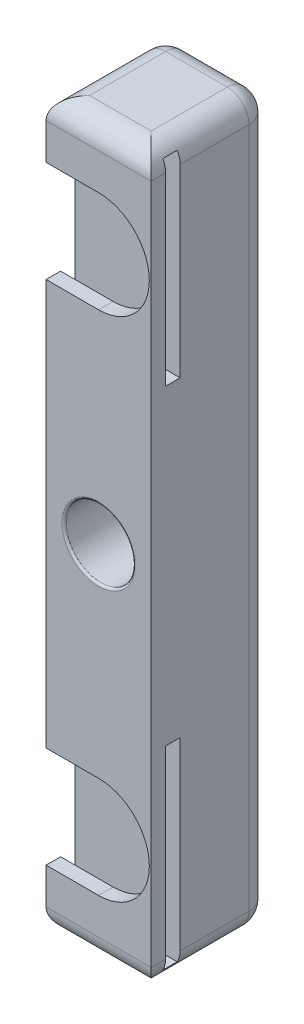
ISO-10303-21;
HEADER;
FILE_DESCRIPTION(('STEP AP214'),'2;1');
FILE_NAME('part.step','',(''),(''),'','','');
FILE_SCHEMA(('AUTOMOTIVE_DESIGN { 1 0 10303 214 1 1 1 1 }'));
ENDSEC;
DATA;
#1=APPLICATION_CONTEXT('core data for automotive mechanical design processes');
#2=APPLICATION_PROTOCOL_DEFINITION('international standard','automotive_design',2000,#1);
#3=PRODUCT_CONTEXT('',#1,'mechanical');
#4=PRODUCT('Part','Part','',(#3));
#5=PRODUCT_RELATED_PRODUCT_CATEGORY('part','',(#4));
#6=PRODUCT_DEFINITION_FORMATION('','',#4);
#7=PRODUCT_DEFINITION_CONTEXT('part definition',#1,'design');
#8=PRODUCT_DEFINITION('design','',#6,#7);
#9=PRODUCT_DEFINITION_SHAPE('','',#8);
#10=(LENGTH_UNIT() NAMED_UNIT(*) SI_UNIT(.MILLI.,.METRE.));
#11=(NAMED_UNIT(*) PLANE_ANGLE_UNIT() SI_UNIT($,.RADIAN.));
#12=(NAMED_UNIT(*) SI_UNIT($,.STERADIAN.) SOLID_ANGLE_UNIT());
#13=UNCERTAINTY_MEASURE_WITH_UNIT(LENGTH_MEASURE(1.E-05),#10,'distance_accuracy_value','');
#14=(GEOMETRIC_REPRESENTATION_CONTEXT(3) GLOBAL_UNCERTAINTY_ASSIGNED_CONTEXT((#13)) GLOBAL_UNIT_ASSIGNED_CONTEXT((#10,
#11,#12)) REPRESENTATION_CONTEXT('',''));
#15=CARTESIAN_POINT('',(0.,0.,0.));
#16=DIRECTION('',(0.,0.,1.));
#17=DIRECTION('',(1.,0.,0.));
#18=AXIS2_PLACEMENT_3D('',#15,#16,#17);
#19=CARTESIAN_POINT('',(-7.25,-50.,16.5));
#20=DIRECTION('',(1.,0.,0.));
#21=DIRECTION('',(0.,0.,-1.));
#22=AXIS2_PLACEMENT_3D('',#19,#20,#21);
#23=PLANE('',#22);
#24=DIRECTION('',(0.,-1.,0.));
#25=VECTOR('',#24,1.);
#26=CARTESIAN_POINT('',(-7.25,-50.,3.));
#27=LINE('',#26,#25);
#28=CARTESIAN_POINT('',(-7.25,47.,3.));
#29=VERTEX_POINT('',#28);
#30=CARTESIAN_POINT('',(-7.25,-47.,3.));
#31=VERTEX_POINT('',#30);
#32=EDGE_CURVE('E358',#29,#31,#27,.T.);
#33=ORIENTED_EDGE('',*,*,#32,.T.);
#34=DIRECTION('',(0.,0.,-1.));
#35=VECTOR('',#34,1.);
#36=CARTESIAN_POINT('',(-7.25,-47.,16.5));
#37=LINE('',#36,#35);
#38=CARTESIAN_POINT('',(-7.25,-47.,12.5));
#39=VERTEX_POINT('',#38);
#40=EDGE_CURVE('E393',#31,#39,#37,.F.);
#41=ORIENTED_EDGE('',*,*,#40,.T.);
#42=DIRECTION('',(0.,1.,0.));
#43=VECTOR('',#42,1.);
#44=CARTESIAN_POINT('',(-7.25,-50.,12.5));
#45=LINE('',#44,#43);
#46=CARTESIAN_POINT('',(-7.25,-21.5,12.5));
#47=VERTEX_POINT('',#46);
#48=EDGE_CURVE('E321',#39,#47,#45,.T.);
#49=ORIENTED_EDGE('',*,*,#48,.T.);
#50=DIRECTION('',(0.,0.,1.));
#51=VECTOR('',#50,1.);
#52=CARTESIAN_POINT('',(-7.25,-21.5,16.5));
#53=LINE('',#52,#51);
#54=CARTESIAN_POINT('',(-7.25,-21.5,14.5));
#55=VERTEX_POINT('',#54);
#56=EDGE_CURVE('E330',#47,#55,#53,.T.);
#57=ORIENTED_EDGE('',*,*,#56,.T.);
#58=DIRECTION('',(0.,1.,0.));
#59=VECTOR('',#58,1.);
#60=CARTESIAN_POINT('',(-7.25,-50.,14.5));
#61=LINE('',#60,#59);
#62=CARTESIAN_POINT('',(-7.25,-28.,14.5));
#63=VERTEX_POINT('',#62);
#64=EDGE_CURVE('E319',#63,#55,#61,.T.);
#65=ORIENTED_EDGE('',*,*,#64,.F.);
#66=DIRECTION('',(0.,0.,1.));
#67=VECTOR('',#66,1.);
#68=CARTESIAN_POINT('',(-7.25,-28.,14.5));
#69=LINE('',#68,#67);
#70=CARTESIAN_POINT('',(-7.25,-28.,16.5));
#71=VERTEX_POINT('',#70);
#72=EDGE_CURVE('E310',#63,#71,#69,.T.);
#73=ORIENTED_EDGE('',*,*,#72,.T.);
#74=DIRECTION('',(0.,-1.,0.));
#75=VECTOR('',#74,1.);
#76=CARTESIAN_POINT('',(-7.25,-50.,16.5));
#77=LINE('',#76,#75);
#78=CARTESIAN_POINT('',(-7.25,28.,16.5));
#79=VERTEX_POINT('',#78);
#80=EDGE_CURVE('E340',#79,#71,#77,.T.);
#81=ORIENTED_EDGE('',*,*,#80,.F.);
#82=DIRECTION('',(0.,0.,1.));
#83=VECTOR('',#82,1.);
#84=CARTESIAN_POINT('',(-7.25,28.,14.5));
#85=LINE('',#84,#83);
#86=CARTESIAN_POINT('',(-7.25,28.,14.5));
#87=VERTEX_POINT('',#86);
#88=EDGE_CURVE('E252',#87,#79,#85,.T.);
#89=ORIENTED_EDGE('',*,*,#88,.F.);
#90=DIRECTION('',(0.,1.,0.));
#91=VECTOR('',#90,1.);
#92=CARTESIAN_POINT('',(-7.25,-50.,14.5));
#93=LINE('',#92,#91);
#94=CARTESIAN_POINT('',(-7.25,21.5,14.5));
#95=VERTEX_POINT('',#94);
#96=EDGE_CURVE('E266',#95,#87,#93,.T.);
#97=ORIENTED_EDGE('',*,*,#96,.F.);
#98=DIRECTION('',(0.,0.,1.));
#99=VECTOR('',#98,1.);
#100=CARTESIAN_POINT('',(-7.25,21.5,16.5));
#101=LINE('',#100,#99);
#102=CARTESIAN_POINT('',(-7.25,21.5,12.5));
#103=VERTEX_POINT('',#102);
#104=EDGE_CURVE('E276',#103,#95,#101,.T.);
#105=ORIENTED_EDGE('',*,*,#104,.F.);
#106=DIRECTION('',(0.,1.,0.));
#107=VECTOR('',#106,1.);
#108=CARTESIAN_POINT('',(-7.25,-50.,12.5));
#109=LINE('',#108,#107);
#110=CARTESIAN_POINT('',(-7.25,47.,12.5));
#111=VERTEX_POINT('',#110);
#112=EDGE_CURVE('E269',#103,#111,#109,.T.);
#113=ORIENTED_EDGE('',*,*,#112,.T.);
#114=DIRECTION('',(0.,0.,-1.));
#115=VECTOR('',#114,1.);
#116=CARTESIAN_POINT('',(-7.25,47.,16.5));
#117=LINE('',#116,#115);
#118=EDGE_CURVE('E388',#111,#29,#117,.T.);
#119=ORIENTED_EDGE('',*,*,#118,.T.);
#120=EDGE_LOOP('',(#33,#41,#49,#57,#65,#73,#81,#89,#97,#105,#113,#119));
#121=FACE_BOUND('',#120,.T.);
#122=ADVANCED_FACE('F41',(#121),#23,.F.);
#123=CARTESIAN_POINT('',(-7.25,47.,16.5));
#124=VERTEX_POINT('',#123);
#125=CARTESIAN_POINT('',(-7.25,42.,16.5));
#126=VERTEX_POINT('',#125);
#127=EDGE_CURVE('E332',#124,#126,#77,.T.);
#128=ORIENTED_EDGE('',*,*,#127,.F.);
#129=DIRECTION('',(0.,0.,-1.));
#130=VECTOR('',#129,1.);
#131=CARTESIAN_POINT('',(-7.25,47.,16.5));
#132=LINE('',#131,#130);
#133=CARTESIAN_POINT('',(-7.25,47.,14.5));
#134=VERTEX_POINT('',#133);
#135=EDGE_CURVE('E264',#124,#134,#132,.T.);
#136=ORIENTED_EDGE('',*,*,#135,.T.);
#137=CARTESIAN_POINT('',(-7.25,42.,14.5));
#138=VERTEX_POINT('',#137);
#139=EDGE_CURVE('E260',#138,#134,#93,.T.);
#140=ORIENTED_EDGE('',*,*,#139,.F.);
#141=DIRECTION('',(0.,0.,1.));
#142=VECTOR('',#141,1.);
#143=CARTESIAN_POINT('',(-7.25,42.,14.5));
#144=LINE('',#143,#142);
#145=EDGE_CURVE('E241',#138,#126,#144,.T.);
#146=ORIENTED_EDGE('',*,*,#145,.T.);
#147=EDGE_LOOP('',(#128,#136,#140,#146));
#148=FACE_BOUND('',#147,.T.);
#149=ADVANCED_FACE('F263',(#148),#23,.F.);
#150=CARTESIAN_POINT('',(4.25,-50.,3.));
#151=DIRECTION('',(0.,-1.,0.));
#152=DIRECTION('',(0.,0.,-1.));
#153=AXIS2_PLACEMENT_3D('',#150,#151,#152);
#154=CYLINDRICAL_SURFACE('',#153,3.);
#155=DIRECTION('',(0.,1.,0.));
#156=VECTOR('',#155,1.);
#157=CARTESIAN_POINT('',(7.25,-50.,3.));
#158=LINE('',#157,#156);
#159=CARTESIAN_POINT('',(7.25,-47.,3.));
#160=VERTEX_POINT('',#159);
#161=CARTESIAN_POINT('',(7.25,47.,3.));
#162=VERTEX_POINT('',#161);
#163=EDGE_CURVE('E365',#160,#162,#158,.T.);
#164=ORIENTED_EDGE('',*,*,#163,.F.);
#165=CARTESIAN_POINT('',(4.25,-47.,3.));
#166=DIRECTION('',(0.,-1.,0.));
#167=DIRECTION('',(0.,0.,-1.));
#168=AXIS2_PLACEMENT_3D('',#165,#166,#167);
#169=CIRCLE('',#168,3.);
#170=CARTESIAN_POINT('',(4.25,-47.,0.));
#171=VERTEX_POINT('',#170);
#172=EDGE_CURVE('E422',#160,#171,#169,.F.);
#173=ORIENTED_EDGE('',*,*,#172,.T.);
#174=DIRECTION('',(0.,1.,0.));
#175=VECTOR('',#174,1.);
#176=CARTESIAN_POINT('',(4.25,-50.,0.));
#177=LINE('',#176,#175);
#178=CARTESIAN_POINT('',(4.25,47.,0.));
#179=VERTEX_POINT('',#178);
#180=EDGE_CURVE('E362',#179,#171,#177,.F.);
#181=ORIENTED_EDGE('',*,*,#180,.F.);
#182=CARTESIAN_POINT('',(4.25,47.,3.));
#183=DIRECTION('',(0.,-1.,0.));
#184=DIRECTION('',(0.,0.,-1.));
#185=AXIS2_PLACEMENT_3D('',#182,#183,#184);
#186=CIRCLE('',#185,3.);
#187=EDGE_CURVE('E419',#179,#162,#186,.T.);
#188=ORIENTED_EDGE('',*,*,#187,.T.);
#189=EDGE_LOOP('',(#164,#173,#181,#188));
#190=FACE_BOUND('',#189,.T.);
#191=ADVANCED_FACE('F581',(#190),#154,.T.);
#192=CARTESIAN_POINT('',(-4.25,-50.,3.));
#193=DIRECTION('',(0.,1.,0.));
#194=DIRECTION('',(0.,0.,1.));
#195=AXIS2_PLACEMENT_3D('',#192,#193,#194);
#196=CYLINDRICAL_SURFACE('',#195,3.);
#197=DIRECTION('',(0.,-1.,0.));
#198=VECTOR('',#197,1.);
#199=CARTESIAN_POINT('',(-4.25,-50.,0.));
#200=LINE('',#199,#198);
#201=CARTESIAN_POINT('',(-4.25,-47.,0.));
#202=VERTEX_POINT('',#201);
#203=CARTESIAN_POINT('',(-4.25,47.,0.));
#204=VERTEX_POINT('',#203);
#205=EDGE_CURVE('E360',#202,#204,#200,.F.);
#206=ORIENTED_EDGE('',*,*,#205,.F.);
#207=CARTESIAN_POINT('',(-4.25,-47.,3.));
#208=DIRECTION('',(0.,1.,0.));
#209=DIRECTION('',(0.,0.,1.));
#210=AXIS2_PLACEMENT_3D('',#207,#208,#209);
#211=CIRCLE('',#210,3.);
#212=EDGE_CURVE('E376',#202,#31,#211,.T.);
#213=ORIENTED_EDGE('',*,*,#212,.T.);
#214=ORIENTED_EDGE('',*,*,#32,.F.);
#215=CARTESIAN_POINT('',(-4.25,47.,3.));
#216=DIRECTION('',(0.,1.,0.));
#217=DIRECTION('',(0.,0.,1.));
#218=AXIS2_PLACEMENT_3D('',#215,#216,#217);
#219=CIRCLE('',#218,3.);
#220=EDGE_CURVE('E372',#29,#204,#219,.F.);
#221=ORIENTED_EDGE('',*,*,#220,.T.);
#222=EDGE_LOOP('',(#206,#213,#214,#221));
#223=FACE_BOUND('',#222,.T.);
#224=ADVANCED_FACE('F601',(#223),#196,.T.);
#225=CARTESIAN_POINT('',(0.,0.,16.5));
#226=DIRECTION('',(0.,0.,-1.));
#227=DIRECTION('',(-1.,0.,0.));
#228=AXIS2_PLACEMENT_3D('',#225,#226,#227);
#229=PLANE('',#228);
#230=CARTESIAN_POINT('',(0.,0.,16.5));
#231=DIRECTION('',(0.,0.,-1.));
#232=DIRECTION('',(-1.,0.,0.));
#233=AXIS2_PLACEMENT_3D('',#230,#231,#232);
#234=CIRCLE('',#233,5.05);
#235=CARTESIAN_POINT('',(-5.05,0.,16.5));
#236=VERTEX_POINT('',#235);
#237=EDGE_CURVE('E371',#236,#236,#234,.T.);
#238=ORIENTED_EDGE('',*,*,#237,.T.);
#239=EDGE_LOOP('',(#238));
#240=FACE_BOUND('',#239,.T.);
#241=CARTESIAN_POINT('',(-7.25,-42.,16.5));
#242=VERTEX_POINT('',#241);
#243=CARTESIAN_POINT('',(-7.25,-47.,16.5));
#244=VERTEX_POINT('',#243);
#245=EDGE_CURVE('E333',#242,#244,#77,.T.);
#246=ORIENTED_EDGE('',*,*,#245,.T.);
#247=DIRECTION('',(1.,0.,0.));
#248=VECTOR('',#247,1.);
#249=CARTESIAN_POINT('',(0.,-47.,16.5));
#250=LINE('',#249,#248);
#251=CARTESIAN_POINT('',(7.25,-47.,16.5));
#252=VERTEX_POINT('',#251);
#253=EDGE_CURVE('E406',#244,#252,#250,.T.);
#254=ORIENTED_EDGE('',*,*,#253,.T.);
#255=DIRECTION('',(0.,1.,0.));
#256=VECTOR('',#255,1.);
#257=CARTESIAN_POINT('',(7.25,-50.,16.5));
#258=LINE('',#257,#256);
#259=CARTESIAN_POINT('',(7.25,47.,16.5));
#260=VERTEX_POINT('',#259);
#261=EDGE_CURVE('E337',#252,#260,#258,.T.);
#262=ORIENTED_EDGE('',*,*,#261,.T.);
#263=DIRECTION('',(-1.,0.,0.));
#264=VECTOR('',#263,1.);
#265=CARTESIAN_POINT('',(0.,47.,16.5));
#266=LINE('',#265,#264);
#267=EDGE_CURVE('E410',#260,#124,#266,.T.);
#268=ORIENTED_EDGE('',*,*,#267,.T.);
#269=ORIENTED_EDGE('',*,*,#127,.T.);
#270=DIRECTION('',(1.,0.,0.));
#271=VECTOR('',#270,1.);
#272=CARTESIAN_POINT('',(0.,42.,16.5));
#273=LINE('',#272,#271);
#274=CARTESIAN_POINT('',(0.,42.,16.5));
#275=VERTEX_POINT('',#274);
#276=EDGE_CURVE('E250',#126,#275,#273,.T.);
#277=ORIENTED_EDGE('',*,*,#276,.T.);
#278=CARTESIAN_POINT('',(0.,35.,16.5));
#279=DIRECTION('',(0.,0.,-1.));
#280=DIRECTION('',(1.,0.,0.));
#281=AXIS2_PLACEMENT_3D('',#278,#279,#280);
#282=CIRCLE('',#281,7.);
#283=CARTESIAN_POINT('',(0.,28.,16.5));
#284=VERTEX_POINT('',#283);
#285=EDGE_CURVE('E461',#275,#284,#282,.T.);
#286=ORIENTED_EDGE('',*,*,#285,.T.);
#287=DIRECTION('',(-1.,0.,0.));
#288=VECTOR('',#287,1.);
#289=CARTESIAN_POINT('',(0.,28.,16.5));
#290=LINE('',#289,#288);
#291=EDGE_CURVE('E519',#284,#79,#290,.T.);
#292=ORIENTED_EDGE('',*,*,#291,.T.);
#293=ORIENTED_EDGE('',*,*,#80,.T.);
#294=DIRECTION('',(-1.,0.,0.));
#295=VECTOR('',#294,1.);
#296=CARTESIAN_POINT('',(0.,-28.,16.5));
#297=LINE('',#296,#295);
#298=CARTESIAN_POINT('',(0.,-28.,16.5));
#299=VERTEX_POINT('',#298);
#300=EDGE_CURVE('E300',#299,#71,#297,.T.);
#301=ORIENTED_EDGE('',*,*,#300,.F.);
#302=CARTESIAN_POINT('',(0.,-35.,16.5));
#303=DIRECTION('',(0.,0.,1.));
#304=DIRECTION('',(1.,0.,0.));
#305=AXIS2_PLACEMENT_3D('',#302,#303,#304);
#306=CIRCLE('',#305,7.);
#307=CARTESIAN_POINT('',(0.,-42.,16.5));
#308=VERTEX_POINT('',#307);
#309=EDGE_CURVE('E283',#308,#299,#306,.T.);
#310=ORIENTED_EDGE('',*,*,#309,.F.);
#311=DIRECTION('',(1.,0.,0.));
#312=VECTOR('',#311,1.);
#313=CARTESIAN_POINT('',(0.,-42.,16.5));
#314=LINE('',#313,#312);
#315=EDGE_CURVE('E288',#242,#308,#314,.T.);
#316=ORIENTED_EDGE('',*,*,#315,.F.);
#317=EDGE_LOOP('',(#246,#254,#262,#268,#269,#277,#286,#292,#293,#301,#310,#316));
#318=FACE_BOUND('',#317,.T.);
#319=ADVANCED_FACE('F534',(#240,#318),#229,.F.);
#320=CARTESIAN_POINT('',(0.,0.,14.5));
#321=DIRECTION('',(0.,0.,-1.));
#322=DIRECTION('',(-1.,0.,0.));
#323=AXIS2_PLACEMENT_3D('',#320,#321,#322);
#324=PLANE('',#323);
#325=ORIENTED_EDGE('',*,*,#139,.T.);
#326=CARTESIAN_POINT('',(-4.25,47.,14.5));
#327=DIRECTION('',(0.,0.,-1.));
#328=DIRECTION('',(-1.,0.,0.));
#329=AXIS2_PLACEMENT_3D('',#326,#327,#328);
#330=CIRCLE('',#329,3.);
#331=CARTESIAN_POINT('',(-6.84807621135332,48.5,14.5));
#332=VERTEX_POINT('',#331);
#333=EDGE_CURVE('E437',#134,#332,#330,.T.);
#334=ORIENTED_EDGE('',*,*,#333,.T.);
#335=DIRECTION('',(1.,0.,0.));
#336=VECTOR('',#335,1.);
#337=CARTESIAN_POINT('',(-13.5,48.5,14.5));
#338=LINE('',#337,#336);
#339=CARTESIAN_POINT('',(6.84807621135332,48.5,14.5));
#340=VERTEX_POINT('',#339);
#341=EDGE_CURVE('E508',#332,#340,#338,.T.);
#342=ORIENTED_EDGE('',*,*,#341,.T.);
#343=CARTESIAN_POINT('',(4.25,47.,14.5));
#344=DIRECTION('',(0.,0.,-1.));
#345=DIRECTION('',(-1.,0.,0.));
#346=AXIS2_PLACEMENT_3D('',#343,#344,#345);
#347=CIRCLE('',#346,3.);
#348=CARTESIAN_POINT('',(7.25,47.,14.5));
#349=VERTEX_POINT('',#348);
#350=EDGE_CURVE('E440',#340,#349,#347,.T.);
#351=ORIENTED_EDGE('',*,*,#350,.T.);
#352=DIRECTION('',(0.,-1.,0.));
#353=VECTOR('',#352,1.);
#354=CARTESIAN_POINT('',(7.25,-50.,14.5));
#355=LINE('',#354,#353);
#356=CARTESIAN_POINT('',(7.25,21.5,14.5));
#357=VERTEX_POINT('',#356);
#358=EDGE_CURVE('E347',#349,#357,#355,.T.);
#359=ORIENTED_EDGE('',*,*,#358,.T.);
#360=DIRECTION('',(-1.,0.,0.));
#361=VECTOR('',#360,1.);
#362=CARTESIAN_POINT('',(-13.5,21.5,14.5));
#363=LINE('',#362,#361);
#364=EDGE_CURVE('E277',#357,#95,#363,.T.);
#365=ORIENTED_EDGE('',*,*,#364,.T.);
#366=ORIENTED_EDGE('',*,*,#96,.T.);
#367=DIRECTION('',(-1.,0.,0.));
#368=VECTOR('',#367,1.);
#369=CARTESIAN_POINT('',(0.,28.,14.5));
#370=LINE('',#369,#368);
#371=CARTESIAN_POINT('',(0.,28.,14.5));
#372=VERTEX_POINT('',#371);
#373=EDGE_CURVE('E261',#372,#87,#370,.T.);
#374=ORIENTED_EDGE('',*,*,#373,.F.);
#375=CARTESIAN_POINT('',(0.,35.,14.5));
#376=DIRECTION('',(0.,0.,-1.));
#377=DIRECTION('',(1.,0.,0.));
#378=AXIS2_PLACEMENT_3D('',#375,#376,#377);
#379=CIRCLE('',#378,7.);
#380=CARTESIAN_POINT('',(0.,42.,14.5));
#381=VERTEX_POINT('',#380);
#382=EDGE_CURVE('E256',#381,#372,#379,.T.);
#383=ORIENTED_EDGE('',*,*,#382,.F.);
#384=DIRECTION('',(1.,0.,0.));
#385=VECTOR('',#384,1.);
#386=CARTESIAN_POINT('',(0.,42.,14.5));
#387=LINE('',#386,#385);
#388=EDGE_CURVE('E242',#138,#381,#387,.T.);
#389=ORIENTED_EDGE('',*,*,#388,.F.);
#390=EDGE_LOOP('',(#325,#334,#342,#351,#359,#365,#366,#374,#383,#389));
#391=FACE_BOUND('',#390,.T.);
#392=ADVANCED_FACE('F257',(#391),#324,.T.);
#393=CARTESIAN_POINT('',(0.,0.,14.5));
#394=DIRECTION('',(0.,0.,-1.));
#395=DIRECTION('',(-1.,0.,0.));
#396=AXIS2_PLACEMENT_3D('',#393,#394,#395);
#397=PLANE('',#396);
#398=DIRECTION('',(1.,0.,0.));
#399=VECTOR('',#398,1.);
#400=CARTESIAN_POINT('',(-13.5,-48.5,14.5));
#401=LINE('',#400,#399);
#402=CARTESIAN_POINT('',(-6.84807621135332,-48.5,14.5));
#403=VERTEX_POINT('',#402);
#404=CARTESIAN_POINT('',(6.84807621135332,-48.5,14.5));
#405=VERTEX_POINT('',#404);
#406=EDGE_CURVE('E314',#403,#405,#401,.T.);
#407=ORIENTED_EDGE('',*,*,#406,.F.);
#408=CARTESIAN_POINT('',(-4.25,-47.,14.5));
#409=DIRECTION('',(0.,0.,-1.));
#410=DIRECTION('',(-1.,0.,0.));
#411=AXIS2_PLACEMENT_3D('',#408,#409,#410);
#412=CIRCLE('',#411,3.);
#413=CARTESIAN_POINT('',(-7.25,-47.,14.5));
#414=VERTEX_POINT('',#413);
#415=EDGE_CURVE('E403',#403,#414,#412,.T.);
#416=ORIENTED_EDGE('',*,*,#415,.T.);
#417=CARTESIAN_POINT('',(-7.25,-42.,14.5));
#418=VERTEX_POINT('',#417);
#419=EDGE_CURVE('E323',#414,#418,#61,.T.);
#420=ORIENTED_EDGE('',*,*,#419,.T.);
#421=DIRECTION('',(1.,0.,0.));
#422=VECTOR('',#421,1.);
#423=CARTESIAN_POINT('',(0.,-42.,14.5));
#424=LINE('',#423,#422);
#425=CARTESIAN_POINT('',(0.,-42.,14.5));
#426=VERTEX_POINT('',#425);
#427=EDGE_CURVE('E293',#418,#426,#424,.T.);
#428=ORIENTED_EDGE('',*,*,#427,.T.);
#429=CARTESIAN_POINT('',(0.,-35.,14.5));
#430=DIRECTION('',(0.,0.,1.));
#431=DIRECTION('',(1.,0.,0.));
#432=AXIS2_PLACEMENT_3D('',#429,#430,#431);
#433=CIRCLE('',#432,7.);
#434=CARTESIAN_POINT('',(0.,-28.,14.5));
#435=VERTEX_POINT('',#434);
#436=EDGE_CURVE('E282',#426,#435,#433,.T.);
#437=ORIENTED_EDGE('',*,*,#436,.T.);
#438=DIRECTION('',(-1.,0.,0.));
#439=VECTOR('',#438,1.);
#440=CARTESIAN_POINT('',(0.,-28.,14.5));
#441=LINE('',#440,#439);
#442=EDGE_CURVE('E290',#435,#63,#441,.T.);
#443=ORIENTED_EDGE('',*,*,#442,.T.);
#444=ORIENTED_EDGE('',*,*,#64,.T.);
#445=DIRECTION('',(-1.,0.,0.));
#446=VECTOR('',#445,1.);
#447=CARTESIAN_POINT('',(-13.5,-21.5,14.5));
#448=LINE('',#447,#446);
#449=CARTESIAN_POINT('',(7.25,-21.5,14.5));
#450=VERTEX_POINT('',#449);
#451=EDGE_CURVE('E302',#450,#55,#448,.T.);
#452=ORIENTED_EDGE('',*,*,#451,.F.);
#453=DIRECTION('',(0.,-1.,0.));
#454=VECTOR('',#453,1.);
#455=CARTESIAN_POINT('',(7.25,-50.,14.5));
#456=LINE('',#455,#454);
#457=CARTESIAN_POINT('',(7.25,-47.,14.5));
#458=VERTEX_POINT('',#457);
#459=EDGE_CURVE('E338',#450,#458,#456,.T.);
#460=ORIENTED_EDGE('',*,*,#459,.T.);
#461=CARTESIAN_POINT('',(4.25,-47.,14.5));
#462=DIRECTION('',(0.,0.,-1.));
#463=DIRECTION('',(-1.,0.,0.));
#464=AXIS2_PLACEMENT_3D('',#461,#462,#463);
#465=CIRCLE('',#464,3.);
#466=EDGE_CURVE('E401',#458,#405,#465,.T.);
#467=ORIENTED_EDGE('',*,*,#466,.T.);
#468=EDGE_LOOP('',(#407,#416,#420,#428,#437,#443,#444,#452,#460,#467));
#469=FACE_BOUND('',#468,.T.);
#470=ADVANCED_FACE('F567',(#469),#397,.T.);
#471=CARTESIAN_POINT('',(7.25,50.,16.5));
#472=DIRECTION('',(0.,-1.,0.));
#473=DIRECTION('',(0.,0.,-1.));
#474=AXIS2_PLACEMENT_3D('',#471,#472,#473);
#475=PLANE('',#474);
#476=DIRECTION('',(0.,0.,-1.));
#477=VECTOR('',#476,1.);
#478=CARTESIAN_POINT('',(-4.25,50.,16.5));
#479=LINE('',#478,#477);
#480=CARTESIAN_POINT('',(-4.25,50.,3.));
#481=VERTEX_POINT('',#480);
#482=CARTESIAN_POINT('',(-4.25,50.,13.5));
#483=VERTEX_POINT('',#482);
#484=EDGE_CURVE('E435',#481,#483,#479,.F.);
#485=ORIENTED_EDGE('',*,*,#484,.T.);
#486=DIRECTION('',(-1.,0.,0.));
#487=VECTOR('',#486,1.);
#488=CARTESIAN_POINT('',(7.25,50.,13.5));
#489=LINE('',#488,#487);
#490=CARTESIAN_POINT('',(4.25,50.,13.5));
#491=VERTEX_POINT('',#490);
#492=EDGE_CURVE('E432',#483,#491,#489,.F.);
#493=ORIENTED_EDGE('',*,*,#492,.T.);
#494=DIRECTION('',(0.,0.,-1.));
#495=VECTOR('',#494,1.);
#496=CARTESIAN_POINT('',(4.25,50.,16.5));
#497=LINE('',#496,#495);
#498=CARTESIAN_POINT('',(4.25,50.,3.));
#499=VERTEX_POINT('',#498);
#500=EDGE_CURVE('E426',#491,#499,#497,.T.);
#501=ORIENTED_EDGE('',*,*,#500,.T.);
#502=DIRECTION('',(-1.,0.,0.));
#503=VECTOR('',#502,1.);
#504=CARTESIAN_POINT('',(-4.25,50.,3.));
#505=LINE('',#504,#503);
#506=EDGE_CURVE('E427',#499,#481,#505,.T.);
#507=ORIENTED_EDGE('',*,*,#506,.T.);
#508=EDGE_LOOP('',(#485,#493,#501,#507));
#509=FACE_BOUND('',#508,.T.);
#510=ADVANCED_FACE('F597',(#509),#475,.F.);
#511=ORIENTED_EDGE('',*,*,#419,.F.);
#512=DIRECTION('',(0.,0.,-1.));
#513=VECTOR('',#512,1.);
#514=CARTESIAN_POINT('',(-7.25,-47.,16.5));
#515=LINE('',#514,#513);
#516=EDGE_CURVE('E391',#414,#244,#515,.F.);
#517=ORIENTED_EDGE('',*,*,#516,.T.);
#518=ORIENTED_EDGE('',*,*,#245,.F.);
#519=DIRECTION('',(0.,0.,1.));
#520=VECTOR('',#519,1.);
#521=CARTESIAN_POINT('',(-7.25,-42.,14.5));
#522=LINE('',#521,#520);
#523=EDGE_CURVE('E304',#418,#242,#522,.T.);
#524=ORIENTED_EDGE('',*,*,#523,.F.);
#525=EDGE_LOOP('',(#511,#517,#518,#524));
#526=FACE_BOUND('',#525,.T.);
#527=ADVANCED_FACE('F625',(#526),#23,.F.);
#528=CARTESIAN_POINT('',(7.25,-50.,16.5));
#529=DIRECTION('',(0.,1.,0.));
#530=DIRECTION('',(0.,0.,1.));
#531=AXIS2_PLACEMENT_3D('',#528,#529,#530);
#532=PLANE('',#531);
#533=DIRECTION('',(1.,0.,0.));
#534=VECTOR('',#533,1.);
#535=CARTESIAN_POINT('',(7.25,-50.,13.5));
#536=LINE('',#535,#534);
#537=CARTESIAN_POINT('',(4.25,-50.,13.5));
#538=VERTEX_POINT('',#537);
#539=CARTESIAN_POINT('',(-4.25,-50.,13.5));
#540=VERTEX_POINT('',#539);
#541=EDGE_CURVE('E384',#538,#540,#536,.F.);
#542=ORIENTED_EDGE('',*,*,#541,.T.);
#543=DIRECTION('',(0.,0.,-1.));
#544=VECTOR('',#543,1.);
#545=CARTESIAN_POINT('',(-4.25,-50.,16.5));
#546=LINE('',#545,#544);
#547=CARTESIAN_POINT('',(-4.25,-50.,3.));
#548=VERTEX_POINT('',#547);
#549=EDGE_CURVE('E383',#540,#548,#546,.T.);
#550=ORIENTED_EDGE('',*,*,#549,.T.);
#551=DIRECTION('',(1.,0.,0.));
#552=VECTOR('',#551,1.);
#553=CARTESIAN_POINT('',(4.25,-50.,3.));
#554=LINE('',#553,#552);
#555=CARTESIAN_POINT('',(4.25,-50.,3.));
#556=VERTEX_POINT('',#555);
#557=EDGE_CURVE('E378',#548,#556,#554,.T.);
#558=ORIENTED_EDGE('',*,*,#557,.T.);
#559=DIRECTION('',(0.,0.,-1.));
#560=VECTOR('',#559,1.);
#561=CARTESIAN_POINT('',(4.25,-50.,16.5));
#562=LINE('',#561,#560);
#563=EDGE_CURVE('E382',#556,#538,#562,.F.);
#564=ORIENTED_EDGE('',*,*,#563,.T.);
#565=EDGE_LOOP('',(#542,#550,#558,#564));
#566=FACE_BOUND('',#565,.T.);
#567=ADVANCED_FACE('F556',(#566),#532,.F.);
#568=CARTESIAN_POINT('',(7.25,-50.,16.5));
#569=DIRECTION('',(-1.,0.,0.));
#570=DIRECTION('',(0.,0.,1.));
#571=AXIS2_PLACEMENT_3D('',#568,#569,#570);
#572=PLANE('',#571);
#573=ORIENTED_EDGE('',*,*,#261,.F.);
#574=DIRECTION('',(0.,0.,-1.));
#575=VECTOR('',#574,1.);
#576=CARTESIAN_POINT('',(7.25,-47.,16.5));
#577=LINE('',#576,#575);
#578=EDGE_CURVE('E418',#252,#458,#577,.T.);
#579=ORIENTED_EDGE('',*,*,#578,.T.);
#580=ORIENTED_EDGE('',*,*,#459,.F.);
#581=DIRECTION('',(0.,0.,-1.));
#582=VECTOR('',#581,1.);
#583=CARTESIAN_POINT('',(7.25,-21.5,16.5));
#584=LINE('',#583,#582);
#585=CARTESIAN_POINT('',(7.25,-21.5,12.5));
#586=VERTEX_POINT('',#585);
#587=EDGE_CURVE('E343',#450,#586,#584,.T.);
#588=ORIENTED_EDGE('',*,*,#587,.T.);
#589=DIRECTION('',(0.,-1.,0.));
#590=VECTOR('',#589,1.);
#591=CARTESIAN_POINT('',(7.25,-50.,12.5));
#592=LINE('',#591,#590);
#593=CARTESIAN_POINT('',(7.25,-47.,12.5));
#594=VERTEX_POINT('',#593);
#595=EDGE_CURVE('E346',#586,#594,#592,.T.);
#596=ORIENTED_EDGE('',*,*,#595,.T.);
#597=DIRECTION('',(0.,0.,-1.));
#598=VECTOR('',#597,1.);
#599=CARTESIAN_POINT('',(7.25,-47.,16.5));
#600=LINE('',#599,#598);
#601=EDGE_CURVE('E416',#594,#160,#600,.T.);
#602=ORIENTED_EDGE('',*,*,#601,.T.);
#603=ORIENTED_EDGE('',*,*,#163,.T.);
#604=DIRECTION('',(0.,0.,-1.));
#605=VECTOR('',#604,1.);
#606=CARTESIAN_POINT('',(7.25,47.,16.5));
#607=LINE('',#606,#605);
#608=CARTESIAN_POINT('',(7.25,47.,12.5));
#609=VERTEX_POINT('',#608);
#610=EDGE_CURVE('E412',#162,#609,#607,.F.);
#611=ORIENTED_EDGE('',*,*,#610,.T.);
#612=DIRECTION('',(0.,-1.,0.));
#613=VECTOR('',#612,1.);
#614=CARTESIAN_POINT('',(7.25,-50.,12.5));
#615=LINE('',#614,#613);
#616=CARTESIAN_POINT('',(7.25,21.5,12.5));
#617=VERTEX_POINT('',#616);
#618=EDGE_CURVE('E352',#609,#617,#615,.T.);
#619=ORIENTED_EDGE('',*,*,#618,.T.);
#620=DIRECTION('',(0.,0.,-1.));
#621=VECTOR('',#620,1.);
#622=CARTESIAN_POINT('',(7.25,21.5,16.5));
#623=LINE('',#622,#621);
#624=EDGE_CURVE('E351',#357,#617,#623,.T.);
#625=ORIENTED_EDGE('',*,*,#624,.F.);
#626=ORIENTED_EDGE('',*,*,#358,.F.);
#627=DIRECTION('',(0.,0.,-1.));
#628=VECTOR('',#627,1.);
#629=CARTESIAN_POINT('',(7.25,47.,16.5));
#630=LINE('',#629,#628);
#631=EDGE_CURVE('E415',#349,#260,#630,.F.);
#632=ORIENTED_EDGE('',*,*,#631,.T.);
#633=EDGE_LOOP('',(#573,#579,#580,#588,#596,#602,#603,#611,#619,#625,#626,#632));
#634=FACE_BOUND('',#633,.T.);
#635=ADVANCED_FACE('F494',(#634),#572,.F.);
#636=CARTESIAN_POINT('',(0.,0.,0.));
#637=DIRECTION('',(0.,0.,-1.));
#638=DIRECTION('',(-1.,0.,0.));
#639=AXIS2_PLACEMENT_3D('',#636,#637,#638);
#640=PLANE('',#639);
#641=ORIENTED_EDGE('',*,*,#180,.T.);
#642=DIRECTION('',(1.,0.,0.));
#643=VECTOR('',#642,1.);
#644=CARTESIAN_POINT('',(-4.25,-47.,0.));
#645=LINE('',#644,#643);
#646=EDGE_CURVE('E428',#171,#202,#645,.F.);
#647=ORIENTED_EDGE('',*,*,#646,.T.);
#648=ORIENTED_EDGE('',*,*,#205,.T.);
#649=DIRECTION('',(-1.,0.,0.));
#650=VECTOR('',#649,1.);
#651=CARTESIAN_POINT('',(4.25,47.,0.));
#652=LINE('',#651,#650);
#653=EDGE_CURVE('E425',#204,#179,#652,.F.);
#654=ORIENTED_EDGE('',*,*,#653,.T.);
#655=EDGE_LOOP('',(#641,#647,#648,#654));
#656=FACE_BOUND('',#655,.T.);
#657=ADVANCED_FACE('F590',(#656),#640,.T.);
#658=CARTESIAN_POINT('',(0.,0.,0.5));
#659=DIRECTION('',(0.,0.,1.));
#660=DIRECTION('',(1.,0.,0.));
#661=AXIS2_PLACEMENT_3D('',#658,#659,#660);
#662=CYLINDRICAL_SURFACE('',#661,4.75);
#663=CARTESIAN_POINT('',(0.,0.,16.2));
#664=DIRECTION('',(0.,0.,-1.));
#665=DIRECTION('',(-1.,0.,0.));
#666=AXIS2_PLACEMENT_3D('',#663,#664,#665);
#667=CIRCLE('',#666,4.75);
#668=CARTESIAN_POINT('',(-4.75,0.,16.2));
#669=VERTEX_POINT('',#668);
#670=EDGE_CURVE('E368',#669,#669,#667,.F.);
#671=ORIENTED_EDGE('',*,*,#670,.T.);
#672=EDGE_LOOP('',(#671));
#673=FACE_BOUND('',#672,.T.);
#674=CARTESIAN_POINT('',(0.,0.,0.5));
#675=DIRECTION('',(0.,0.,1.));
#676=DIRECTION('',(1.,0.,0.));
#677=AXIS2_PLACEMENT_3D('',#674,#675,#676);
#678=CIRCLE('',#677,4.75);
#679=CARTESIAN_POINT('',(4.75,0.,0.5));
#680=VERTEX_POINT('',#679);
#681=EDGE_CURVE('E329',#680,#680,#678,.T.);
#682=ORIENTED_EDGE('',*,*,#681,.F.);
#683=EDGE_LOOP('',(#682));
#684=FACE_BOUND('',#683,.T.);
#685=ADVANCED_FACE('F657',(#673,#684),#662,.F.);
#686=CARTESIAN_POINT('',(0.,0.,0.5));
#687=DIRECTION('',(0.,0.,1.));
#688=DIRECTION('',(1.,0.,0.));
#689=AXIS2_PLACEMENT_3D('',#686,#687,#688);
#690=PLANE('',#689);
#691=ORIENTED_EDGE('',*,*,#681,.T.);
#692=EDGE_LOOP('',(#691));
#693=FACE_BOUND('',#692,.T.);
#694=ADVANCED_FACE('F646',(#693),#690,.T.);
#695=CARTESIAN_POINT('',(-13.5,-48.5,12.5));
#696=DIRECTION('',(0.,-1.,0.));
#697=DIRECTION('',(0.,0.,-1.));
#698=AXIS2_PLACEMENT_3D('',#695,#696,#697);
#699=PLANE('',#698);
#700=DIRECTION('',(1.,0.,0.));
#701=VECTOR('',#700,1.);
#702=CARTESIAN_POINT('',(-13.5,-48.5,12.5));
#703=LINE('',#702,#701);
#704=CARTESIAN_POINT('',(-6.84807621135332,-48.5,12.5));
#705=VERTEX_POINT('',#704);
#706=CARTESIAN_POINT('',(6.84807621135332,-48.5,12.5));
#707=VERTEX_POINT('',#706);
#708=EDGE_CURVE('E313',#705,#707,#703,.T.);
#709=ORIENTED_EDGE('',*,*,#708,.F.);
#710=DIRECTION('',(0.,0.,-1.));
#711=VECTOR('',#710,1.);
#712=CARTESIAN_POINT('',(-6.84807621135332,-48.5,12.5));
#713=LINE('',#712,#711);
#714=EDGE_CURVE('E402',#705,#403,#713,.F.);
#715=ORIENTED_EDGE('',*,*,#714,.T.);
#716=ORIENTED_EDGE('',*,*,#406,.T.);
#717=DIRECTION('',(0.,0.,-1.));
#718=VECTOR('',#717,1.);
#719=CARTESIAN_POINT('',(6.84807621135332,-48.5,14.5));
#720=LINE('',#719,#718);
#721=EDGE_CURVE('E397',#405,#707,#720,.T.);
#722=ORIENTED_EDGE('',*,*,#721,.T.);
#723=EDGE_LOOP('',(#709,#715,#716,#722));
#724=FACE_BOUND('',#723,.T.);
#725=ADVANCED_FACE('F648',(#724),#699,.F.);
#726=CARTESIAN_POINT('',(-13.5,-21.5,12.5));
#727=DIRECTION('',(0.,1.,0.));
#728=DIRECTION('',(0.,0.,1.));
#729=AXIS2_PLACEMENT_3D('',#726,#727,#728);
#730=PLANE('',#729);
#731=DIRECTION('',(-1.,0.,0.));
#732=VECTOR('',#731,1.);
#733=CARTESIAN_POINT('',(-13.5,-21.5,12.5));
#734=LINE('',#733,#732);
#735=EDGE_CURVE('E311',#586,#47,#734,.T.);
#736=ORIENTED_EDGE('',*,*,#735,.F.);
#737=ORIENTED_EDGE('',*,*,#587,.F.);
#738=ORIENTED_EDGE('',*,*,#451,.T.);
#739=ORIENTED_EDGE('',*,*,#56,.F.);
#740=EDGE_LOOP('',(#736,#737,#738,#739));
#741=FACE_BOUND('',#740,.T.);
#742=ADVANCED_FACE('F573',(#741),#730,.F.);
#743=CARTESIAN_POINT('',(0.,0.,12.5));
#744=DIRECTION('',(0.,0.,-1.));
#745=DIRECTION('',(-1.,0.,0.));
#746=AXIS2_PLACEMENT_3D('',#743,#744,#745);
#747=PLANE('',#746);
#748=ORIENTED_EDGE('',*,*,#48,.F.);
#749=CARTESIAN_POINT('',(-4.25,-47.,12.5));
#750=DIRECTION('',(0.,0.,-1.));
#751=DIRECTION('',(-1.,0.,0.));
#752=AXIS2_PLACEMENT_3D('',#749,#750,#751);
#753=CIRCLE('',#752,3.);
#754=EDGE_CURVE('E400',#39,#705,#753,.F.);
#755=ORIENTED_EDGE('',*,*,#754,.T.);
#756=ORIENTED_EDGE('',*,*,#708,.T.);
#757=CARTESIAN_POINT('',(4.25,-47.,12.5));
#758=DIRECTION('',(0.,0.,-1.));
#759=DIRECTION('',(-1.,0.,0.));
#760=AXIS2_PLACEMENT_3D('',#757,#758,#759);
#761=CIRCLE('',#760,3.);
#762=EDGE_CURVE('E394',#707,#594,#761,.F.);
#763=ORIENTED_EDGE('',*,*,#762,.T.);
#764=ORIENTED_EDGE('',*,*,#595,.F.);
#765=ORIENTED_EDGE('',*,*,#735,.T.);
#766=EDGE_LOOP('',(#748,#755,#756,#763,#764,#765));
#767=FACE_BOUND('',#766,.T.);
#768=ADVANCED_FACE('F641',(#767),#747,.F.);
#769=CARTESIAN_POINT('',(0.,-35.,14.5));
#770=DIRECTION('',(0.,0.,1.));
#771=DIRECTION('',(1.,0.,0.));
#772=AXIS2_PLACEMENT_3D('',#769,#770,#771);
#773=CYLINDRICAL_SURFACE('',#772,7.);
#774=ORIENTED_EDGE('',*,*,#309,.T.);
#775=DIRECTION('',(0.,0.,1.));
#776=VECTOR('',#775,1.);
#777=CARTESIAN_POINT('',(0.,-28.,14.5));
#778=LINE('',#777,#776);
#779=EDGE_CURVE('E295',#435,#299,#778,.T.);
#780=ORIENTED_EDGE('',*,*,#779,.F.);
#781=ORIENTED_EDGE('',*,*,#436,.F.);
#782=DIRECTION('',(0.,0.,1.));
#783=VECTOR('',#782,1.);
#784=CARTESIAN_POINT('',(0.,-42.,14.5));
#785=LINE('',#784,#783);
#786=EDGE_CURVE('E305',#426,#308,#785,.T.);
#787=ORIENTED_EDGE('',*,*,#786,.T.);
#788=EDGE_LOOP('',(#774,#780,#781,#787));
#789=FACE_BOUND('',#788,.T.);
#790=ADVANCED_FACE('F642',(#789),#773,.F.);
#791=CARTESIAN_POINT('',(0.,-42.,14.5));
#792=DIRECTION('',(0.,-1.,0.));
#793=DIRECTION('',(0.,0.,-1.));
#794=AXIS2_PLACEMENT_3D('',#791,#792,#793);
#795=PLANE('',#794);
#796=ORIENTED_EDGE('',*,*,#315,.T.);
#797=ORIENTED_EDGE('',*,*,#786,.F.);
#798=ORIENTED_EDGE('',*,*,#427,.F.);
#799=ORIENTED_EDGE('',*,*,#523,.T.);
#800=EDGE_LOOP('',(#796,#797,#798,#799));
#801=FACE_BOUND('',#800,.T.);
#802=ADVANCED_FACE('F640',(#801),#795,.F.);
#803=CARTESIAN_POINT('',(0.,-28.,14.5));
#804=DIRECTION('',(0.,1.,0.));
#805=DIRECTION('',(0.,0.,1.));
#806=AXIS2_PLACEMENT_3D('',#803,#804,#805);
#807=PLANE('',#806);
#808=ORIENTED_EDGE('',*,*,#300,.T.);
#809=ORIENTED_EDGE('',*,*,#72,.F.);
#810=ORIENTED_EDGE('',*,*,#442,.F.);
#811=ORIENTED_EDGE('',*,*,#779,.T.);
#812=EDGE_LOOP('',(#808,#809,#810,#811));
#813=FACE_BOUND('',#812,.T.);
#814=ADVANCED_FACE('F736',(#813),#807,.F.);
#815=CARTESIAN_POINT('',(-13.5,21.5,12.5));
#816=DIRECTION('',(0.,1.,0.));
#817=DIRECTION('',(0.,0.,1.));
#818=AXIS2_PLACEMENT_3D('',#815,#816,#817);
#819=PLANE('',#818);
#820=ORIENTED_EDGE('',*,*,#104,.T.);
#821=ORIENTED_EDGE('',*,*,#364,.F.);
#822=ORIENTED_EDGE('',*,*,#624,.T.);
#823=DIRECTION('',(-1.,0.,0.));
#824=VECTOR('',#823,1.);
#825=CARTESIAN_POINT('',(-13.5,21.5,12.5));
#826=LINE('',#825,#824);
#827=EDGE_CURVE('E270',#617,#103,#826,.T.);
#828=ORIENTED_EDGE('',*,*,#827,.T.);
#829=EDGE_LOOP('',(#820,#821,#822,#828));
#830=FACE_BOUND('',#829,.T.);
#831=ADVANCED_FACE('F501',(#830),#819,.T.);
#832=CARTESIAN_POINT('',(-13.5,48.5,12.5));
#833=DIRECTION('',(0.,-1.,0.));
#834=DIRECTION('',(0.,0.,-1.));
#835=AXIS2_PLACEMENT_3D('',#832,#833,#834);
#836=PLANE('',#835);
#837=ORIENTED_EDGE('',*,*,#341,.F.);
#838=DIRECTION('',(0.,0.,-1.));
#839=VECTOR('',#838,1.);
#840=CARTESIAN_POINT('',(-6.84807621135332,48.5,14.5));
#841=LINE('',#840,#839);
#842=CARTESIAN_POINT('',(-6.84807621135332,48.5,12.5));
#843=VERTEX_POINT('',#842);
#844=EDGE_CURVE('E64',#332,#843,#841,.T.);
#845=ORIENTED_EDGE('',*,*,#844,.T.);
#846=DIRECTION('',(1.,0.,0.));
#847=VECTOR('',#846,1.);
#848=CARTESIAN_POINT('',(-13.5,48.5,12.5));
#849=LINE('',#848,#847);
#850=CARTESIAN_POINT('',(6.84807621135332,48.5,12.5));
#851=VERTEX_POINT('',#850);
#852=EDGE_CURVE('E275',#843,#851,#849,.T.);
#853=ORIENTED_EDGE('',*,*,#852,.T.);
#854=DIRECTION('',(0.,0.,-1.));
#855=VECTOR('',#854,1.);
#856=CARTESIAN_POINT('',(6.84807621135332,48.5,12.5));
#857=LINE('',#856,#855);
#858=EDGE_CURVE('E441',#851,#340,#857,.F.);
#859=ORIENTED_EDGE('',*,*,#858,.T.);
#860=EDGE_LOOP('',(#837,#845,#853,#859));
#861=FACE_BOUND('',#860,.T.);
#862=ADVANCED_FACE('F602',(#861),#836,.T.);
#863=CARTESIAN_POINT('',(0.,0.,12.5));
#864=DIRECTION('',(0.,0.,-1.));
#865=DIRECTION('',(-1.,0.,0.));
#866=AXIS2_PLACEMENT_3D('',#863,#864,#865);
#867=PLANE('',#866);
#868=ORIENTED_EDGE('',*,*,#852,.F.);
#869=CARTESIAN_POINT('',(-4.25,47.,12.5));
#870=DIRECTION('',(0.,0.,-1.));
#871=DIRECTION('',(-1.,0.,0.));
#872=AXIS2_PLACEMENT_3D('',#869,#870,#871);
#873=CIRCLE('',#872,3.);
#874=EDGE_CURVE('E11',#843,#111,#873,.F.);
#875=ORIENTED_EDGE('',*,*,#874,.T.);
#876=ORIENTED_EDGE('',*,*,#112,.F.);
#877=ORIENTED_EDGE('',*,*,#827,.F.);
#878=ORIENTED_EDGE('',*,*,#618,.F.);
#879=CARTESIAN_POINT('',(4.25,47.,12.5));
#880=DIRECTION('',(0.,0.,-1.));
#881=DIRECTION('',(-1.,0.,0.));
#882=AXIS2_PLACEMENT_3D('',#879,#880,#881);
#883=CIRCLE('',#882,3.);
#884=EDGE_CURVE('E49',#609,#851,#883,.F.);
#885=ORIENTED_EDGE('',*,*,#884,.T.);
#886=EDGE_LOOP('',(#868,#875,#876,#877,#878,#885));
#887=FACE_BOUND('',#886,.T.);
#888=ADVANCED_FACE('F498',(#887),#867,.F.);
#889=CARTESIAN_POINT('',(0.,35.,14.5));
#890=DIRECTION('',(0.,0.,1.));
#891=DIRECTION('',(1.,0.,0.));
#892=AXIS2_PLACEMENT_3D('',#889,#890,#891);
#893=CYLINDRICAL_SURFACE('',#892,7.);
#894=ORIENTED_EDGE('',*,*,#285,.F.);
#895=DIRECTION('',(0.,0.,1.));
#896=VECTOR('',#895,1.);
#897=CARTESIAN_POINT('',(0.,42.,14.5));
#898=LINE('',#897,#896);
#899=EDGE_CURVE('E255',#381,#275,#898,.T.);
#900=ORIENTED_EDGE('',*,*,#899,.F.);
#901=ORIENTED_EDGE('',*,*,#382,.T.);
#902=DIRECTION('',(0.,0.,1.));
#903=VECTOR('',#902,1.);
#904=CARTESIAN_POINT('',(0.,28.,14.5));
#905=LINE('',#904,#903);
#906=EDGE_CURVE('E515',#372,#284,#905,.T.);
#907=ORIENTED_EDGE('',*,*,#906,.T.);
#908=EDGE_LOOP('',(#894,#900,#901,#907));
#909=FACE_BOUND('',#908,.T.);
#910=ADVANCED_FACE('F527',(#909),#893,.F.);
#911=CARTESIAN_POINT('',(0.,28.,14.5));
#912=DIRECTION('',(0.,1.,0.));
#913=DIRECTION('',(0.,0.,1.));
#914=AXIS2_PLACEMENT_3D('',#911,#912,#913);
#915=PLANE('',#914);
#916=ORIENTED_EDGE('',*,*,#291,.F.);
#917=ORIENTED_EDGE('',*,*,#906,.F.);
#918=ORIENTED_EDGE('',*,*,#373,.T.);
#919=ORIENTED_EDGE('',*,*,#88,.T.);
#920=EDGE_LOOP('',(#916,#917,#918,#919));
#921=FACE_BOUND('',#920,.T.);
#922=ADVANCED_FACE('F532',(#921),#915,.T.);
#923=CARTESIAN_POINT('',(0.,42.,14.5));
#924=DIRECTION('',(0.,-1.,0.));
#925=DIRECTION('',(0.,0.,-1.));
#926=AXIS2_PLACEMENT_3D('',#923,#924,#925);
#927=PLANE('',#926);
#928=ORIENTED_EDGE('',*,*,#276,.F.);
#929=ORIENTED_EDGE('',*,*,#145,.F.);
#930=ORIENTED_EDGE('',*,*,#388,.T.);
#931=ORIENTED_EDGE('',*,*,#899,.T.);
#932=EDGE_LOOP('',(#928,#929,#930,#931));
#933=FACE_BOUND('',#932,.T.);
#934=ADVANCED_FACE('F243',(#933),#927,.T.);
#935=CARTESIAN_POINT('',(0.,0.,16.2));
#936=DIRECTION('',(0.,0.,-1.));
#937=DIRECTION('',(-1.,0.,0.));
#938=AXIS2_PLACEMENT_3D('',#935,#936,#937);
#939=TOROIDAL_SURFACE('',#938,5.05,0.3);
#940=ORIENTED_EDGE('',*,*,#237,.F.);
#941=EDGE_LOOP('',(#940));
#942=FACE_BOUND('',#941,.T.);
#943=ORIENTED_EDGE('',*,*,#670,.F.);
#944=EDGE_LOOP('',(#943));
#945=FACE_BOUND('',#944,.T.);
#946=ADVANCED_FACE('F806',(#942,#945),#939,.T.);
#947=CARTESIAN_POINT('',(4.25,-47.,16.5));
#948=DIRECTION('',(0.,0.,-1.));
#949=DIRECTION('',(-1.,0.,0.));
#950=AXIS2_PLACEMENT_3D('',#947,#948,#949);
#951=CYLINDRICAL_SURFACE('',#950,3.);
#952=ORIENTED_EDGE('',*,*,#466,.F.);
#953=ORIENTED_EDGE('',*,*,#578,.F.);
#954=CARTESIAN_POINT('',(4.25,-47.,13.5));
#955=DIRECTION('',(0.707106781186547,0.,-0.707106781186547));
#956=DIRECTION('',(-0.707106781186547,0.,-0.707106781186547));
#957=AXIS2_PLACEMENT_3D('',#954,#955,#956);
#958=ELLIPSE('',#957,4.24264068711928,3.);
#959=EDGE_CURVE('E458',#538,#252,#958,.F.);
#960=ORIENTED_EDGE('',*,*,#959,.F.);
#961=ORIENTED_EDGE('',*,*,#563,.F.);
#962=CARTESIAN_POINT('',(4.25,-47.,3.));
#963=DIRECTION('',(0.,0.,-1.));
#964=DIRECTION('',(-1.,0.,0.));
#965=AXIS2_PLACEMENT_3D('',#962,#963,#964);
#966=CIRCLE('',#965,3.);
#967=EDGE_CURVE('E451',#160,#556,#966,.T.);
#968=ORIENTED_EDGE('',*,*,#967,.F.);
#969=ORIENTED_EDGE('',*,*,#601,.F.);
#970=ORIENTED_EDGE('',*,*,#762,.F.);
#971=ORIENTED_EDGE('',*,*,#721,.F.);
#972=EDGE_LOOP('',(#952,#953,#960,#961,#968,#969,#970,#971));
#973=FACE_BOUND('',#972,.T.);
#974=ADVANCED_FACE('F562',(#973),#951,.T.);
#975=CARTESIAN_POINT('',(0.,-47.,13.5));
#976=DIRECTION('',(1.,0.,0.));
#977=DIRECTION('',(0.,0.,-1.));
#978=AXIS2_PLACEMENT_3D('',#975,#976,#977);
#979=CYLINDRICAL_SURFACE('',#978,3.);
#980=ORIENTED_EDGE('',*,*,#959,.T.);
#981=ORIENTED_EDGE('',*,*,#253,.F.);
#982=CARTESIAN_POINT('',(-4.25,-47.,13.5));
#983=DIRECTION('',(0.707106781186547,0.,0.707106781186547));
#984=DIRECTION('',(0.707106781186547,0.,-0.707106781186547));
#985=AXIS2_PLACEMENT_3D('',#982,#983,#984);
#986=ELLIPSE('',#985,4.24264068711928,3.);
#987=EDGE_CURVE('E455',#540,#244,#986,.F.);
#988=ORIENTED_EDGE('',*,*,#987,.F.);
#989=ORIENTED_EDGE('',*,*,#541,.F.);
#990=EDGE_LOOP('',(#980,#981,#988,#989));
#991=FACE_BOUND('',#990,.T.);
#992=ADVANCED_FACE('F544',(#991),#979,.T.);
#993=CARTESIAN_POINT('',(4.25,-47.,3.));
#994=DIRECTION('',(0.,1.,0.));
#995=DIRECTION('',(0.,0.,1.));
#996=AXIS2_PLACEMENT_3D('',#993,#994,#995);
#997=SPHERICAL_SURFACE('',#996,3.);
#998=ORIENTED_EDGE('',*,*,#172,.F.);
#999=ORIENTED_EDGE('',*,*,#967,.T.);
#1000=CARTESIAN_POINT('',(4.25,-47.,3.));
#1001=DIRECTION('',(-1.,0.,0.));
#1002=DIRECTION('',(0.,0.,1.));
#1003=AXIS2_PLACEMENT_3D('',#1000,#1001,#1002);
#1004=CIRCLE('',#1003,3.);
#1005=EDGE_CURVE('E446',#171,#556,#1004,.T.);
#1006=ORIENTED_EDGE('',*,*,#1005,.F.);
#1007=EDGE_LOOP('',(#998,#999,#1006));
#1008=FACE_BOUND('',#1007,.T.);
#1009=ADVANCED_FACE('F582',(#1008),#997,.T.);
#1010=CARTESIAN_POINT('',(-4.25,-47.,16.5));
#1011=DIRECTION('',(0.,0.,-1.));
#1012=DIRECTION('',(-1.,0.,0.));
#1013=AXIS2_PLACEMENT_3D('',#1010,#1011,#1012);
#1014=CYLINDRICAL_SURFACE('',#1013,3.);
#1015=ORIENTED_EDGE('',*,*,#754,.F.);
#1016=ORIENTED_EDGE('',*,*,#40,.F.);
#1017=CARTESIAN_POINT('',(-4.25,-47.,3.));
#1018=DIRECTION('',(0.,0.,-1.));
#1019=DIRECTION('',(-1.,0.,0.));
#1020=AXIS2_PLACEMENT_3D('',#1017,#1018,#1019);
#1021=CIRCLE('',#1020,3.);
#1022=EDGE_CURVE('E450',#548,#31,#1021,.T.);
#1023=ORIENTED_EDGE('',*,*,#1022,.F.);
#1024=ORIENTED_EDGE('',*,*,#549,.F.);
#1025=ORIENTED_EDGE('',*,*,#987,.T.);
#1026=ORIENTED_EDGE('',*,*,#516,.F.);
#1027=ORIENTED_EDGE('',*,*,#415,.F.);
#1028=ORIENTED_EDGE('',*,*,#714,.F.);
#1029=EDGE_LOOP('',(#1015,#1016,#1023,#1024,#1025,#1026,#1027,#1028));
#1030=FACE_BOUND('',#1029,.T.);
#1031=ADVANCED_FACE('F552',(#1030),#1014,.T.);
#1032=CARTESIAN_POINT('',(7.25,-47.,3.));
#1033=DIRECTION('',(-1.,0.,0.));
#1034=DIRECTION('',(0.,0.,1.));
#1035=AXIS2_PLACEMENT_3D('',#1032,#1033,#1034);
#1036=CYLINDRICAL_SURFACE('',#1035,3.);
#1037=ORIENTED_EDGE('',*,*,#1005,.T.);
#1038=ORIENTED_EDGE('',*,*,#557,.F.);
#1039=CARTESIAN_POINT('',(-4.25,-47.,3.));
#1040=DIRECTION('',(-1.,0.,0.));
#1041=DIRECTION('',(0.,0.,1.));
#1042=AXIS2_PLACEMENT_3D('',#1039,#1040,#1041);
#1043=CIRCLE('',#1042,3.);
#1044=EDGE_CURVE('E444',#202,#548,#1043,.T.);
#1045=ORIENTED_EDGE('',*,*,#1044,.F.);
#1046=ORIENTED_EDGE('',*,*,#646,.F.);
#1047=EDGE_LOOP('',(#1037,#1038,#1045,#1046));
#1048=FACE_BOUND('',#1047,.T.);
#1049=ADVANCED_FACE('F611',(#1048),#1036,.T.);
#1050=CARTESIAN_POINT('',(-4.25,-47.,3.));
#1051=DIRECTION('',(0.,1.,0.));
#1052=DIRECTION('',(0.,0.,1.));
#1053=AXIS2_PLACEMENT_3D('',#1050,#1051,#1052);
#1054=SPHERICAL_SURFACE('',#1053,3.);
#1055=ORIENTED_EDGE('',*,*,#1022,.T.);
#1056=ORIENTED_EDGE('',*,*,#212,.F.);
#1057=ORIENTED_EDGE('',*,*,#1044,.T.);
#1058=EDGE_LOOP('',(#1055,#1056,#1057));
#1059=FACE_BOUND('',#1058,.T.);
#1060=ADVANCED_FACE('F607',(#1059),#1054,.T.);
#1061=CARTESIAN_POINT('',(7.25,47.,3.));
#1062=DIRECTION('',(1.,0.,0.));
#1063=DIRECTION('',(0.,0.,-1.));
#1064=AXIS2_PLACEMENT_3D('',#1061,#1062,#1063);
#1065=CYLINDRICAL_SURFACE('',#1064,3.);
#1066=CARTESIAN_POINT('',(4.25,47.,3.));
#1067=DIRECTION('',(1.,0.,0.));
#1068=DIRECTION('',(0.,0.,-1.));
#1069=AXIS2_PLACEMENT_3D('',#1066,#1067,#1068);
#1070=CIRCLE('',#1069,3.);
#1071=EDGE_CURVE('E44',#179,#499,#1070,.T.);
#1072=ORIENTED_EDGE('',*,*,#1071,.F.);
#1073=ORIENTED_EDGE('',*,*,#653,.F.);
#1074=CARTESIAN_POINT('',(-4.25,47.,3.));
#1075=DIRECTION('',(-1.,0.,0.));
#1076=DIRECTION('',(0.,0.,1.));
#1077=AXIS2_PLACEMENT_3D('',#1074,#1075,#1076);
#1078=CIRCLE('',#1077,3.);
#1079=EDGE_CURVE('E472',#481,#204,#1078,.T.);
#1080=ORIENTED_EDGE('',*,*,#1079,.F.);
#1081=ORIENTED_EDGE('',*,*,#506,.F.);
#1082=EDGE_LOOP('',(#1072,#1073,#1080,#1081));
#1083=FACE_BOUND('',#1082,.T.);
#1084=ADVANCED_FACE('F43',(#1083),#1065,.T.);
#1085=CARTESIAN_POINT('',(4.25,47.,3.));
#1086=DIRECTION('',(0.,-1.,0.));
#1087=DIRECTION('',(0.,0.,-1.));
#1088=AXIS2_PLACEMENT_3D('',#1085,#1086,#1087);
#1089=SPHERICAL_SURFACE('',#1088,3.);
#1090=ORIENTED_EDGE('',*,*,#187,.F.);
#1091=ORIENTED_EDGE('',*,*,#1071,.T.);
#1092=CARTESIAN_POINT('',(4.25,47.,3.));
#1093=DIRECTION('',(0.,0.,1.));
#1094=DIRECTION('',(1.,0.,0.));
#1095=AXIS2_PLACEMENT_3D('',#1092,#1093,#1094);
#1096=CIRCLE('',#1095,3.);
#1097=EDGE_CURVE('E469',#162,#499,#1096,.T.);
#1098=ORIENTED_EDGE('',*,*,#1097,.F.);
#1099=EDGE_LOOP('',(#1090,#1091,#1098));
#1100=FACE_BOUND('',#1099,.T.);
#1101=ADVANCED_FACE('F485',(#1100),#1089,.T.);
#1102=CARTESIAN_POINT('',(-4.25,47.,3.));
#1103=DIRECTION('',(0.,-1.,0.));
#1104=DIRECTION('',(0.,0.,-1.));
#1105=AXIS2_PLACEMENT_3D('',#1102,#1103,#1104);
#1106=SPHERICAL_SURFACE('',#1105,3.);
#1107=ORIENTED_EDGE('',*,*,#1079,.T.);
#1108=ORIENTED_EDGE('',*,*,#220,.F.);
#1109=CARTESIAN_POINT('',(-4.25,47.,3.));
#1110=DIRECTION('',(0.,0.,1.));
#1111=DIRECTION('',(1.,0.,0.));
#1112=AXIS2_PLACEMENT_3D('',#1109,#1110,#1111);
#1113=CIRCLE('',#1112,3.);
#1114=EDGE_CURVE('E467',#481,#29,#1113,.T.);
#1115=ORIENTED_EDGE('',*,*,#1114,.F.);
#1116=EDGE_LOOP('',(#1107,#1108,#1115));
#1117=FACE_BOUND('',#1116,.T.);
#1118=ADVANCED_FACE('F589',(#1117),#1106,.T.);
#1119=CARTESIAN_POINT('',(4.25,47.,16.5));
#1120=DIRECTION('',(0.,0.,-1.));
#1121=DIRECTION('',(-1.,0.,0.));
#1122=AXIS2_PLACEMENT_3D('',#1119,#1120,#1121);
#1123=CYLINDRICAL_SURFACE('',#1122,3.);
#1124=ORIENTED_EDGE('',*,*,#1097,.T.);
#1125=ORIENTED_EDGE('',*,*,#500,.F.);
#1126=CARTESIAN_POINT('',(4.25,47.,13.5));
#1127=DIRECTION('',(0.707106781186547,0.,-0.707106781186547));
#1128=DIRECTION('',(-0.707106781186547,0.,-0.707106781186547));
#1129=AXIS2_PLACEMENT_3D('',#1126,#1127,#1128);
#1130=ELLIPSE('',#1129,4.24264068711928,3.);
#1131=EDGE_CURVE('E462',#260,#491,#1130,.F.);
#1132=ORIENTED_EDGE('',*,*,#1131,.F.);
#1133=ORIENTED_EDGE('',*,*,#631,.F.);
#1134=ORIENTED_EDGE('',*,*,#350,.F.);
#1135=ORIENTED_EDGE('',*,*,#858,.F.);
#1136=ORIENTED_EDGE('',*,*,#884,.F.);
#1137=ORIENTED_EDGE('',*,*,#610,.F.);
#1138=EDGE_LOOP('',(#1124,#1125,#1132,#1133,#1134,#1135,#1136,#1137));
#1139=FACE_BOUND('',#1138,.T.);
#1140=ADVANCED_FACE('F490',(#1139),#1123,.T.);
#1141=CARTESIAN_POINT('',(-4.25,47.,16.5));
#1142=DIRECTION('',(0.,0.,-1.));
#1143=DIRECTION('',(-1.,0.,0.));
#1144=AXIS2_PLACEMENT_3D('',#1141,#1142,#1143);
#1145=CYLINDRICAL_SURFACE('',#1144,3.);
#1146=ORIENTED_EDGE('',*,*,#333,.F.);
#1147=ORIENTED_EDGE('',*,*,#135,.F.);
#1148=CARTESIAN_POINT('',(-4.25,47.,13.5));
#1149=DIRECTION('',(-0.707106781186547,0.,-0.707106781186547));
#1150=DIRECTION('',(0.707106781186547,0.,-0.707106781186547));
#1151=AXIS2_PLACEMENT_3D('',#1148,#1149,#1150);
#1152=ELLIPSE('',#1151,4.24264068711928,3.);
#1153=EDGE_CURVE('E465',#483,#124,#1152,.F.);
#1154=ORIENTED_EDGE('',*,*,#1153,.F.);
#1155=ORIENTED_EDGE('',*,*,#484,.F.);
#1156=ORIENTED_EDGE('',*,*,#1114,.T.);
#1157=ORIENTED_EDGE('',*,*,#118,.F.);
#1158=ORIENTED_EDGE('',*,*,#874,.F.);
#1159=ORIENTED_EDGE('',*,*,#844,.F.);
#1160=EDGE_LOOP('',(#1146,#1147,#1154,#1155,#1156,#1157,#1158,#1159));
#1161=FACE_BOUND('',#1160,.T.);
#1162=ADVANCED_FACE('F593',(#1161),#1145,.T.);
#1163=CARTESIAN_POINT('',(0.,47.,13.5));
#1164=DIRECTION('',(-1.,0.,0.));
#1165=DIRECTION('',(0.,0.,1.));
#1166=AXIS2_PLACEMENT_3D('',#1163,#1164,#1165);
#1167=CYLINDRICAL_SURFACE('',#1166,3.);
#1168=ORIENTED_EDGE('',*,*,#1131,.T.);
#1169=ORIENTED_EDGE('',*,*,#492,.F.);
#1170=ORIENTED_EDGE('',*,*,#1153,.T.);
#1171=ORIENTED_EDGE('',*,*,#267,.F.);
#1172=EDGE_LOOP('',(#1168,#1169,#1170,#1171));
#1173=FACE_BOUND('',#1172,.T.);
#1174=ADVANCED_FACE('F596',(#1173),#1167,.T.);
#1175=CLOSED_SHELL('',(#122,#149,#191,#224,#319,#392,#470,#510,#527,#567,#635,#657,#685,#694,
#725,#742,#768,#790,#802,#814,#831,#862,#888,#910,#922,#934,#946,#974,#992,#1009,#1031,#1049,
#1060,#1084,#1101,#1118,#1140,#1162,#1174));
#1176=MANIFOLD_SOLID_BREP('B2',#1175);
#1177=ADVANCED_BREP_SHAPE_REPRESENTATION('',(#18,#1176),#14);
#1178=SHAPE_DEFINITION_REPRESENTATION(#9,#1177);
ENDSEC;
END-ISO-10303-21;
